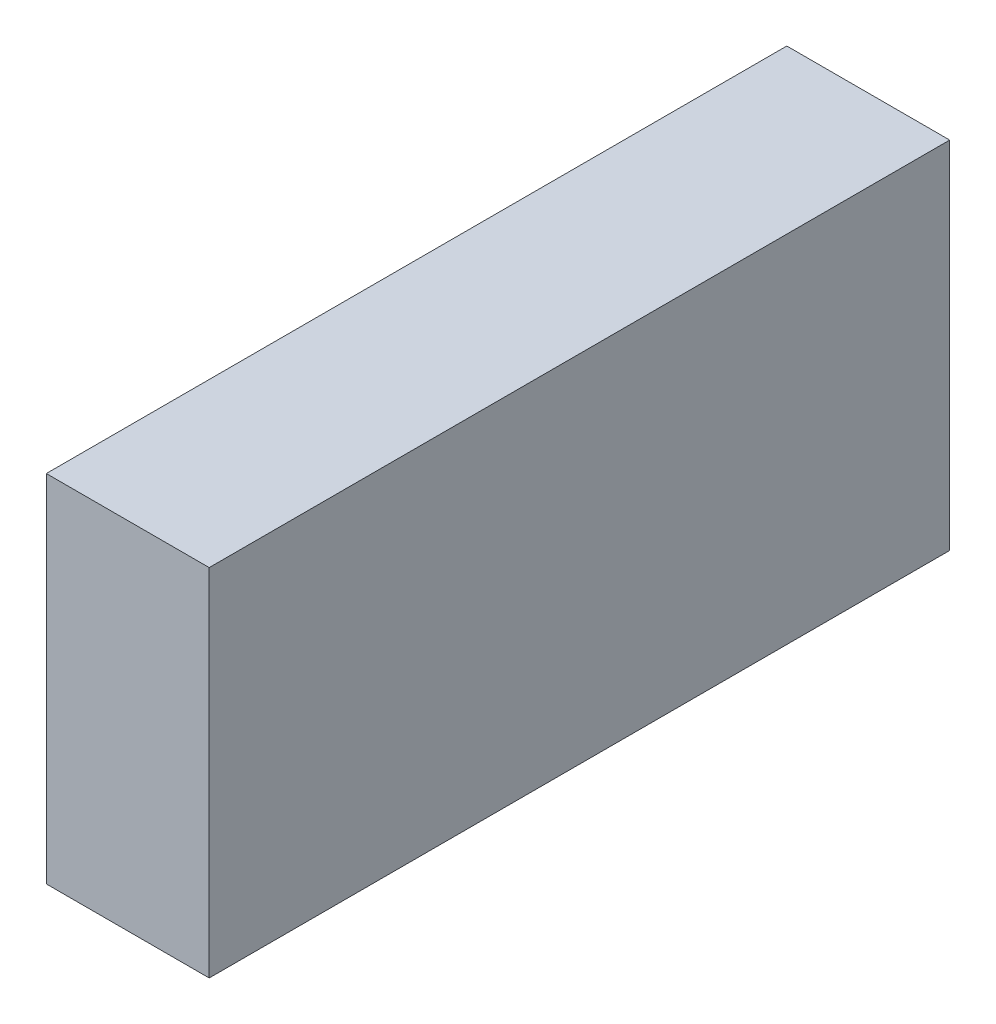
ISO-10303-21;
HEADER;
FILE_DESCRIPTION(('STEP AP214'),'2;1');
FILE_NAME('part.step','',(''),(''),'','','');
FILE_SCHEMA(('AUTOMOTIVE_DESIGN { 1 0 10303 214 1 1 1 1 }'));
ENDSEC;
DATA;
#1=APPLICATION_CONTEXT('core data for automotive mechanical design processes');
#2=APPLICATION_PROTOCOL_DEFINITION('international standard','automotive_design',2000,#1);
#3=PRODUCT_CONTEXT('',#1,'mechanical');
#4=PRODUCT('Part','Part','',(#3));
#5=PRODUCT_RELATED_PRODUCT_CATEGORY('part','',(#4));
#6=PRODUCT_DEFINITION_FORMATION('','',#4);
#7=PRODUCT_DEFINITION_CONTEXT('part definition',#1,'design');
#8=PRODUCT_DEFINITION('design','',#6,#7);
#9=PRODUCT_DEFINITION_SHAPE('','',#8);
#10=(LENGTH_UNIT() NAMED_UNIT(*) SI_UNIT(.MILLI.,.METRE.));
#11=(NAMED_UNIT(*) PLANE_ANGLE_UNIT() SI_UNIT($,.RADIAN.));
#12=(NAMED_UNIT(*) SI_UNIT($,.STERADIAN.) SOLID_ANGLE_UNIT());
#13=UNCERTAINTY_MEASURE_WITH_UNIT(LENGTH_MEASURE(1.E-05),#10,'distance_accuracy_value','');
#14=(GEOMETRIC_REPRESENTATION_CONTEXT(3) GLOBAL_UNCERTAINTY_ASSIGNED_CONTEXT((#13)) GLOBAL_UNIT_ASSIGNED_CONTEXT((#10,
#11,#12)) REPRESENTATION_CONTEXT('',''));
#15=CARTESIAN_POINT('',(0.,0.,0.));
#16=DIRECTION('',(0.,0.,1.));
#17=DIRECTION('',(1.,0.,0.));
#18=AXIS2_PLACEMENT_3D('',#15,#16,#17);
#19=CARTESIAN_POINT('',(-0.01,-0.01,-100.));
#20=DIRECTION('',(0.,0.,-1.));
#21=DIRECTION('',(0.,1.,0.));
#22=AXIS2_PLACEMENT_3D('',#19,#20,#21);
#23=PLANE('',#22);
#24=DIRECTION('',(0.,1.,0.));
#25=VECTOR('',#24,1.);
#26=CARTESIAN_POINT('',(22.,24.,-100.));
#27=LINE('',#26,#25);
#28=CARTESIAN_POINT('',(22.,0.,-100.));
#29=VERTEX_POINT('',#28);
#30=CARTESIAN_POINT('',(22.,48.,-100.));
#31=VERTEX_POINT('',#30);
#32=EDGE_CURVE('E69',#29,#31,#27,.T.);
#33=ORIENTED_EDGE('',*,*,#32,.F.);
#34=DIRECTION('',(1.,0.,0.));
#35=VECTOR('',#34,1.);
#36=CARTESIAN_POINT('',(11.,0.,-100.));
#37=LINE('',#36,#35);
#38=CARTESIAN_POINT('',(0.,0.,-100.));
#39=VERTEX_POINT('',#38);
#40=EDGE_CURVE('E56',#39,#29,#37,.T.);
#41=ORIENTED_EDGE('',*,*,#40,.F.);
#42=DIRECTION('',(0.,-1.,0.));
#43=VECTOR('',#42,1.);
#44=CARTESIAN_POINT('',(0.,24.,-100.));
#45=LINE('',#44,#43);
#46=CARTESIAN_POINT('',(0.,48.,-100.));
#47=VERTEX_POINT('',#46);
#48=EDGE_CURVE('E21',#47,#39,#45,.T.);
#49=ORIENTED_EDGE('',*,*,#48,.F.);
#50=DIRECTION('',(-1.,0.,0.));
#51=VECTOR('',#50,1.);
#52=CARTESIAN_POINT('',(11.,48.,-100.));
#53=LINE('',#52,#51);
#54=EDGE_CURVE('E82',#31,#47,#53,.T.);
#55=ORIENTED_EDGE('',*,*,#54,.F.);
#56=EDGE_LOOP('',(#33,#41,#49,#55));
#57=FACE_BOUND('',#56,.T.);
#58=ADVANCED_FACE('F17',(#57),#23,.T.);
#59=CARTESIAN_POINT('',(0.,-0.00999999999999891,-100.01));
#60=DIRECTION('',(-1.,0.,0.));
#61=DIRECTION('',(0.,0.,1.));
#62=AXIS2_PLACEMENT_3D('',#59,#60,#61);
#63=PLANE('',#62);
#64=DIRECTION('',(0.,0.,1.));
#65=VECTOR('',#64,1.);
#66=CARTESIAN_POINT('',(0.,48.,-50.));
#67=LINE('',#66,#65);
#68=CARTESIAN_POINT('',(0.,48.,0.));
#69=VERTEX_POINT('',#68);
#70=EDGE_CURVE('E65',#47,#69,#67,.T.);
#71=ORIENTED_EDGE('',*,*,#70,.F.);
#72=ORIENTED_EDGE('',*,*,#48,.T.);
#73=DIRECTION('',(0.,0.,-1.));
#74=VECTOR('',#73,1.);
#75=CARTESIAN_POINT('',(0.,0.,-50.));
#76=LINE('',#75,#74);
#77=CARTESIAN_POINT('',(0.,0.,0.));
#78=VERTEX_POINT('',#77);
#79=EDGE_CURVE('E62',#78,#39,#76,.T.);
#80=ORIENTED_EDGE('',*,*,#79,.F.);
#81=DIRECTION('',(0.,-1.,0.));
#82=VECTOR('',#81,1.);
#83=CARTESIAN_POINT('',(0.,24.,0.));
#84=LINE('',#83,#82);
#85=EDGE_CURVE('E84',#69,#78,#84,.T.);
#86=ORIENTED_EDGE('',*,*,#85,.F.);
#87=EDGE_LOOP('',(#71,#72,#80,#86));
#88=FACE_BOUND('',#87,.T.);
#89=ADVANCED_FACE('F61',(#88),#63,.T.);
#90=CARTESIAN_POINT('',(-0.01,0.,0.01));
#91=DIRECTION('',(0.,-1.,0.));
#92=DIRECTION('',(0.,0.,-1.));
#93=AXIS2_PLACEMENT_3D('',#90,#91,#92);
#94=PLANE('',#93);
#95=DIRECTION('',(0.,0.,-1.));
#96=VECTOR('',#95,1.);
#97=CARTESIAN_POINT('',(22.,0.,-50.));
#98=LINE('',#97,#96);
#99=CARTESIAN_POINT('',(22.,0.,0.));
#100=VERTEX_POINT('',#99);
#101=EDGE_CURVE('E71',#100,#29,#98,.T.);
#102=ORIENTED_EDGE('',*,*,#101,.F.);
#103=DIRECTION('',(1.,0.,0.));
#104=VECTOR('',#103,1.);
#105=CARTESIAN_POINT('',(11.,0.,0.));
#106=LINE('',#105,#104);
#107=EDGE_CURVE('E75',#78,#100,#106,.T.);
#108=ORIENTED_EDGE('',*,*,#107,.F.);
#109=ORIENTED_EDGE('',*,*,#79,.T.);
#110=ORIENTED_EDGE('',*,*,#40,.T.);
#111=EDGE_LOOP('',(#102,#108,#109,#110));
#112=FACE_BOUND('',#111,.T.);
#113=ADVANCED_FACE('F73',(#112),#94,.T.);
#114=CARTESIAN_POINT('',(22.,-0.00999999999999891,0.0100000000000033));
#115=DIRECTION('',(1.,0.,0.));
#116=DIRECTION('',(0.,0.,-1.));
#117=AXIS2_PLACEMENT_3D('',#114,#115,#116);
#118=PLANE('',#117);
#119=DIRECTION('',(0.,0.,-1.));
#120=VECTOR('',#119,1.);
#121=CARTESIAN_POINT('',(22.,48.,-50.));
#122=LINE('',#121,#120);
#123=CARTESIAN_POINT('',(22.,48.,0.));
#124=VERTEX_POINT('',#123);
#125=EDGE_CURVE('E36',#124,#31,#122,.T.);
#126=ORIENTED_EDGE('',*,*,#125,.F.);
#127=DIRECTION('',(0.,1.,0.));
#128=VECTOR('',#127,1.);
#129=CARTESIAN_POINT('',(22.,24.,0.));
#130=LINE('',#129,#128);
#131=EDGE_CURVE('E27',#100,#124,#130,.T.);
#132=ORIENTED_EDGE('',*,*,#131,.F.);
#133=ORIENTED_EDGE('',*,*,#101,.T.);
#134=ORIENTED_EDGE('',*,*,#32,.T.);
#135=EDGE_LOOP('',(#126,#132,#133,#134));
#136=FACE_BOUND('',#135,.T.);
#137=ADVANCED_FACE('F89',(#136),#118,.T.);
#138=CARTESIAN_POINT('',(-0.01,48.,-100.01));
#139=DIRECTION('',(0.,1.,0.));
#140=DIRECTION('',(0.,0.,1.));
#141=AXIS2_PLACEMENT_3D('',#138,#139,#140);
#142=PLANE('',#141);
#143=ORIENTED_EDGE('',*,*,#125,.T.);
#144=ORIENTED_EDGE('',*,*,#54,.T.);
#145=ORIENTED_EDGE('',*,*,#70,.T.);
#146=DIRECTION('',(-1.,0.,0.));
#147=VECTOR('',#146,1.);
#148=CARTESIAN_POINT('',(11.,48.,0.));
#149=LINE('',#148,#147);
#150=EDGE_CURVE('E11',#124,#69,#149,.T.);
#151=ORIENTED_EDGE('',*,*,#150,.F.);
#152=EDGE_LOOP('',(#143,#144,#145,#151));
#153=FACE_BOUND('',#152,.T.);
#154=ADVANCED_FACE('F91',(#153),#142,.T.);
#155=CARTESIAN_POINT('',(-0.01,48.01,0.));
#156=DIRECTION('',(0.,0.,1.));
#157=DIRECTION('',(0.,-1.,0.));
#158=AXIS2_PLACEMENT_3D('',#155,#156,#157);
#159=PLANE('',#158);
#160=ORIENTED_EDGE('',*,*,#131,.T.);
#161=ORIENTED_EDGE('',*,*,#150,.T.);
#162=ORIENTED_EDGE('',*,*,#85,.T.);
#163=ORIENTED_EDGE('',*,*,#107,.T.);
#164=EDGE_LOOP('',(#160,#161,#162,#163));
#165=FACE_BOUND('',#164,.T.);
#166=ADVANCED_FACE('F19',(#165),#159,.T.);
#167=CLOSED_SHELL('',(#58,#89,#113,#137,#154,#166));
#168=MANIFOLD_SOLID_BREP('B1',#167);
#169=ADVANCED_BREP_SHAPE_REPRESENTATION('',(#18,#168),#14);
#170=SHAPE_DEFINITION_REPRESENTATION(#9,#169);
ENDSEC;
END-ISO-10303-21;
